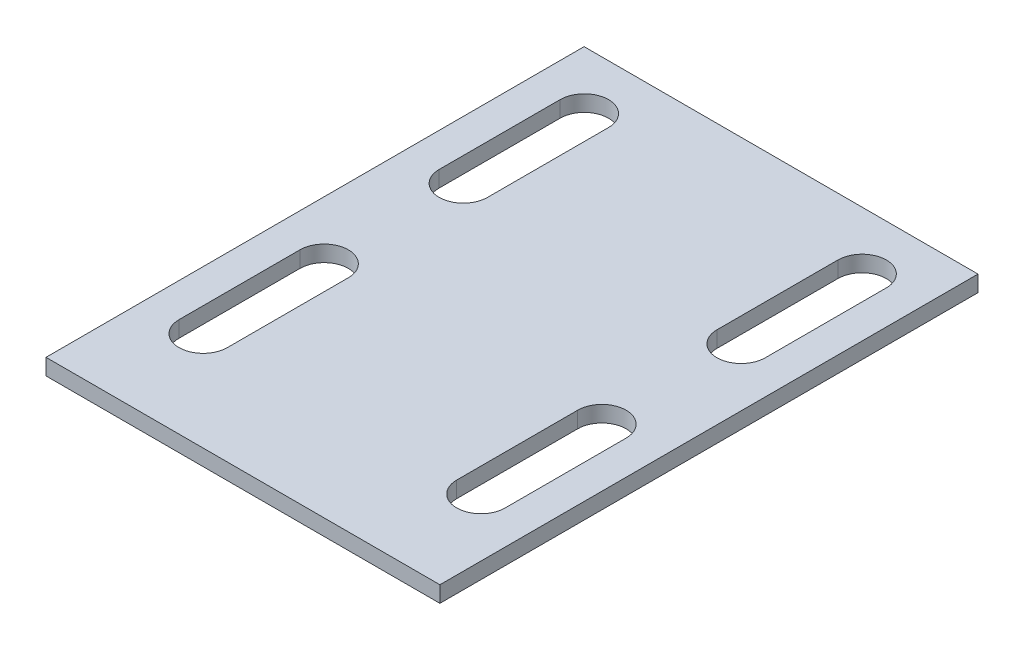
ISO-10303-21;
HEADER;
FILE_DESCRIPTION(('STEP AP214'),'2;1');
FILE_NAME('part.step','',(''),(''),'','','');
FILE_SCHEMA(('AUTOMOTIVE_DESIGN { 1 0 10303 214 1 1 1 1 }'));
ENDSEC;
DATA;
#1=APPLICATION_CONTEXT('core data for automotive mechanical design processes');
#2=APPLICATION_PROTOCOL_DEFINITION('international standard','automotive_design',2000,#1);
#3=PRODUCT_CONTEXT('',#1,'mechanical');
#4=PRODUCT('Part','Part','',(#3));
#5=PRODUCT_RELATED_PRODUCT_CATEGORY('part','',(#4));
#6=PRODUCT_DEFINITION_FORMATION('','',#4);
#7=PRODUCT_DEFINITION_CONTEXT('part definition',#1,'design');
#8=PRODUCT_DEFINITION('design','',#6,#7);
#9=PRODUCT_DEFINITION_SHAPE('','',#8);
#10=(LENGTH_UNIT() NAMED_UNIT(*) SI_UNIT(.MILLI.,.METRE.));
#11=(NAMED_UNIT(*) PLANE_ANGLE_UNIT() SI_UNIT($,.RADIAN.));
#12=(NAMED_UNIT(*) SI_UNIT($,.STERADIAN.) SOLID_ANGLE_UNIT());
#13=UNCERTAINTY_MEASURE_WITH_UNIT(LENGTH_MEASURE(1.E-05),#10,'distance_accuracy_value','');
#14=(GEOMETRIC_REPRESENTATION_CONTEXT(3) GLOBAL_UNCERTAINTY_ASSIGNED_CONTEXT((#13)) GLOBAL_UNIT_ASSIGNED_CONTEXT((#10,
#11,#12)) REPRESENTATION_CONTEXT('',''));
#15=CARTESIAN_POINT('',(0.,0.,0.));
#16=DIRECTION('',(0.,0.,1.));
#17=DIRECTION('',(1.,0.,0.));
#18=AXIS2_PLACEMENT_3D('',#15,#16,#17);
#19=CARTESIAN_POINT('',(0.,5.,0.));
#20=DIRECTION('',(0.,1.,0.));
#21=DIRECTION('',(0.,0.,1.));
#22=AXIS2_PLACEMENT_3D('',#19,#20,#21);
#23=PLANE('',#22);
#24=DIRECTION('',(0.,0.,1.));
#25=VECTOR('',#24,1.);
#26=CARTESIAN_POINT('',(10.5000000000001,5.,0.));
#27=LINE('',#26,#25);
#28=CARTESIAN_POINT('',(10.5000000000001,5.,-87.2215680213413));
#29=VERTEX_POINT('',#28);
#30=CARTESIAN_POINT('',(10.5000000000001,5.,-49.7215680213413));
#31=VERTEX_POINT('',#30);
#32=EDGE_CURVE('E272',#29,#31,#27,.T.);
#33=ORIENTED_EDGE('',*,*,#32,.F.);
#34=CARTESIAN_POINT('',(18.0000000000001,5.,-87.2215680213413));
#35=DIRECTION('',(0.,1.,0.));
#36=DIRECTION('',(0.,0.,1.));
#37=AXIS2_PLACEMENT_3D('',#34,#35,#36);
#38=CIRCLE('',#37,7.49999999999999);
#39=CARTESIAN_POINT('',(25.5000000000001,5.,-87.2215680213413));
#40=VERTEX_POINT('',#39);
#41=EDGE_CURVE('E259',#40,#29,#38,.T.);
#42=ORIENTED_EDGE('',*,*,#41,.F.);
#43=DIRECTION('',(0.,0.,1.));
#44=VECTOR('',#43,1.);
#45=CARTESIAN_POINT('',(25.5000000000001,5.,0.));
#46=LINE('',#45,#44);
#47=CARTESIAN_POINT('',(25.5000000000001,5.,-49.7215680213413));
#48=VERTEX_POINT('',#47);
#49=EDGE_CURVE('E264',#40,#48,#46,.T.);
#50=ORIENTED_EDGE('',*,*,#49,.T.);
#51=CARTESIAN_POINT('',(18.0000000000001,5.,-49.7215680213413));
#52=DIRECTION('',(0.,1.,0.));
#53=DIRECTION('',(0.,0.,1.));
#54=AXIS2_PLACEMENT_3D('',#51,#52,#53);
#55=CIRCLE('',#54,7.49999999999999);
#56=EDGE_CURVE('E268',#31,#48,#55,.T.);
#57=ORIENTED_EDGE('',*,*,#56,.F.);
#58=EDGE_LOOP('',(#33,#42,#50,#57));
#59=FACE_BOUND('',#58,.T.);
#60=DIRECTION('',(0.,0.,1.));
#61=VECTOR('',#60,1.);
#62=CARTESIAN_POINT('',(10.5000000000001,5.,0.));
#63=LINE('',#62,#61);
#64=CARTESIAN_POINT('',(10.5000000000001,5.,-167.875007928777));
#65=VERTEX_POINT('',#64);
#66=CARTESIAN_POINT('',(10.5000000000001,5.,-130.375007928777));
#67=VERTEX_POINT('',#66);
#68=EDGE_CURVE('E226',#65,#67,#63,.T.);
#69=ORIENTED_EDGE('',*,*,#68,.F.);
#70=CARTESIAN_POINT('',(18.0000000000001,5.,-167.875007928777));
#71=DIRECTION('',(0.,1.,0.));
#72=DIRECTION('',(0.,0.,1.));
#73=AXIS2_PLACEMENT_3D('',#70,#71,#72);
#74=CIRCLE('',#73,7.5);
#75=CARTESIAN_POINT('',(25.5000000000001,5.,-167.875007928777));
#76=VERTEX_POINT('',#75);
#77=EDGE_CURVE('E213',#76,#65,#74,.T.);
#78=ORIENTED_EDGE('',*,*,#77,.F.);
#79=DIRECTION('',(0.,0.,1.));
#80=VECTOR('',#79,1.);
#81=CARTESIAN_POINT('',(25.4999999999997,5.,0.));
#82=LINE('',#81,#80);
#83=CARTESIAN_POINT('',(25.5,5.,-130.375007928777));
#84=VERTEX_POINT('',#83);
#85=EDGE_CURVE('E218',#76,#84,#82,.T.);
#86=ORIENTED_EDGE('',*,*,#85,.T.);
#87=CARTESIAN_POINT('',(18.,5.,-130.375007928777));
#88=DIRECTION('',(0.,1.,0.));
#89=DIRECTION('',(0.,0.,1.));
#90=AXIS2_PLACEMENT_3D('',#87,#88,#89);
#91=CIRCLE('',#90,7.49999999999995);
#92=EDGE_CURVE('E222',#67,#84,#91,.T.);
#93=ORIENTED_EDGE('',*,*,#92,.F.);
#94=EDGE_LOOP('',(#69,#78,#86,#93));
#95=FACE_BOUND('',#94,.T.);
#96=DIRECTION('',(0.,0.,1.));
#97=VECTOR('',#96,1.);
#98=CARTESIAN_POINT('',(111.6,5.,0.));
#99=LINE('',#98,#97);
#100=CARTESIAN_POINT('',(111.6,5.,-167.875007928777));
#101=VERTEX_POINT('',#100);
#102=CARTESIAN_POINT('',(111.6,5.,-130.375007928777));
#103=VERTEX_POINT('',#102);
#104=EDGE_CURVE('E355',#101,#103,#99,.T.);
#105=ORIENTED_EDGE('',*,*,#104,.T.);
#106=CARTESIAN_POINT('',(104.1,5.,-130.375007928777));
#107=DIRECTION('',(0.,1.,0.));
#108=DIRECTION('',(0.,0.,1.));
#109=AXIS2_PLACEMENT_3D('',#106,#107,#108);
#110=CIRCLE('',#109,7.49999999999995);
#111=CARTESIAN_POINT('',(96.6,5.,-130.375007928777));
#112=VERTEX_POINT('',#111);
#113=EDGE_CURVE('E304',#103,#112,#110,.F.);
#114=ORIENTED_EDGE('',*,*,#113,.T.);
#115=DIRECTION('',(0.,0.,1.));
#116=VECTOR('',#115,1.);
#117=CARTESIAN_POINT('',(96.6000000000002,5.,-1.78745906964651E-13));
#118=LINE('',#117,#116);
#119=CARTESIAN_POINT('',(96.5999999999999,5.,-167.875007928777));
#120=VERTEX_POINT('',#119);
#121=EDGE_CURVE('E346',#120,#112,#118,.T.);
#122=ORIENTED_EDGE('',*,*,#121,.F.);
#123=CARTESIAN_POINT('',(104.1,5.,-167.875007928777));
#124=DIRECTION('',(0.,1.,0.));
#125=DIRECTION('',(0.,0.,1.));
#126=AXIS2_PLACEMENT_3D('',#123,#124,#125);
#127=CIRCLE('',#126,7.5);
#128=EDGE_CURVE('E351',#120,#101,#127,.F.);
#129=ORIENTED_EDGE('',*,*,#128,.T.);
#130=EDGE_LOOP('',(#105,#114,#122,#129));
#131=FACE_BOUND('',#130,.T.);
#132=DIRECTION('',(0.,0.,1.));
#133=VECTOR('',#132,1.);
#134=CARTESIAN_POINT('',(111.6,5.,0.));
#135=LINE('',#134,#133);
#136=CARTESIAN_POINT('',(111.6,5.,-87.2215680213414));
#137=VERTEX_POINT('',#136);
#138=CARTESIAN_POINT('',(111.6,5.,-49.7215680213414));
#139=VERTEX_POINT('',#138);
#140=EDGE_CURVE('E314',#137,#139,#135,.T.);
#141=ORIENTED_EDGE('',*,*,#140,.T.);
#142=CARTESIAN_POINT('',(104.1,5.,-49.7215680213414));
#143=DIRECTION('',(0.,1.,0.));
#144=DIRECTION('',(0.,0.,1.));
#145=AXIS2_PLACEMENT_3D('',#142,#143,#144);
#146=CIRCLE('',#145,7.49999999999999);
#147=CARTESIAN_POINT('',(96.6,5.,-49.7215680213414));
#148=VERTEX_POINT('',#147);
#149=EDGE_CURVE('E258',#139,#148,#146,.F.);
#150=ORIENTED_EDGE('',*,*,#149,.T.);
#151=DIRECTION('',(0.,0.,1.));
#152=VECTOR('',#151,1.);
#153=CARTESIAN_POINT('',(96.6,5.,0.));
#154=LINE('',#153,#152);
#155=CARTESIAN_POINT('',(96.6,5.,-87.2215680213414));
#156=VERTEX_POINT('',#155);
#157=EDGE_CURVE('E305',#156,#148,#154,.T.);
#158=ORIENTED_EDGE('',*,*,#157,.F.);
#159=CARTESIAN_POINT('',(104.1,5.,-87.2215680213414));
#160=DIRECTION('',(0.,1.,0.));
#161=DIRECTION('',(0.,0.,1.));
#162=AXIS2_PLACEMENT_3D('',#159,#160,#161);
#163=CIRCLE('',#162,7.49999999999999);
#164=EDGE_CURVE('E310',#156,#137,#163,.F.);
#165=ORIENTED_EDGE('',*,*,#164,.T.);
#166=EDGE_LOOP('',(#141,#150,#158,#165));
#167=FACE_BOUND('',#166,.T.);
#168=DIRECTION('',(0.,0.,-1.));
#169=VECTOR('',#168,1.);
#170=CARTESIAN_POINT('',(0.,5.,0.));
#171=LINE('',#170,#169);
#172=CARTESIAN_POINT('',(0.,5.,-19.));
#173=VERTEX_POINT('',#172);
#174=CARTESIAN_POINT('',(0.,5.,-185.8));
#175=VERTEX_POINT('',#174);
#176=EDGE_CURVE('E192',#173,#175,#171,.T.);
#177=ORIENTED_EDGE('',*,*,#176,.F.);
#178=DIRECTION('',(1.,0.,0.));
#179=VECTOR('',#178,1.);
#180=CARTESIAN_POINT('',(0.,5.,-19.));
#181=LINE('',#180,#179);
#182=CARTESIAN_POINT('',(122.1,5.,-19.));
#183=VERTEX_POINT('',#182);
#184=EDGE_CURVE('E54',#173,#183,#181,.T.);
#185=ORIENTED_EDGE('',*,*,#184,.T.);
#186=DIRECTION('',(0.,0.,-1.));
#187=VECTOR('',#186,1.);
#188=CARTESIAN_POINT('',(122.1,5.,0.));
#189=LINE('',#188,#187);
#190=CARTESIAN_POINT('',(122.1,5.,-185.8));
#191=VERTEX_POINT('',#190);
#192=EDGE_CURVE('E188',#183,#191,#189,.T.);
#193=ORIENTED_EDGE('',*,*,#192,.T.);
#194=DIRECTION('',(-1.,0.,0.));
#195=VECTOR('',#194,1.);
#196=CARTESIAN_POINT('',(0.,5.,-185.8));
#197=LINE('',#196,#195);
#198=EDGE_CURVE('E377',#191,#175,#197,.T.);
#199=ORIENTED_EDGE('',*,*,#198,.T.);
#200=EDGE_LOOP('',(#177,#185,#193,#199));
#201=FACE_BOUND('',#200,.T.);
#202=ADVANCED_FACE('F38',(#59,#95,#131,#167,#201),#23,.T.);
#203=CARTESIAN_POINT('',(0.,0.,0.));
#204=DIRECTION('',(0.,1.,0.));
#205=DIRECTION('',(0.,0.,1.));
#206=AXIS2_PLACEMENT_3D('',#203,#204,#205);
#207=PLANE('',#206);
#208=CARTESIAN_POINT('',(18.0000000000001,0.,-87.2215680213413));
#209=DIRECTION('',(0.,1.,0.));
#210=DIRECTION('',(0.,0.,1.));
#211=AXIS2_PLACEMENT_3D('',#208,#209,#210);
#212=CIRCLE('',#211,7.49999999999999);
#213=CARTESIAN_POINT('',(25.5000000000001,0.,-87.2215680213413));
#214=VERTEX_POINT('',#213);
#215=CARTESIAN_POINT('',(10.5000000000001,0.,-87.2215680213413));
#216=VERTEX_POINT('',#215);
#217=EDGE_CURVE('E249',#214,#216,#212,.T.);
#218=ORIENTED_EDGE('',*,*,#217,.T.);
#219=DIRECTION('',(0.,0.,1.));
#220=VECTOR('',#219,1.);
#221=CARTESIAN_POINT('',(10.5000000000001,0.,0.));
#222=LINE('',#221,#220);
#223=CARTESIAN_POINT('',(10.5000000000001,0.,-49.7215680213413));
#224=VERTEX_POINT('',#223);
#225=EDGE_CURVE('E263',#216,#224,#222,.T.);
#226=ORIENTED_EDGE('',*,*,#225,.T.);
#227=CARTESIAN_POINT('',(18.0000000000001,0.,-49.7215680213413));
#228=DIRECTION('',(0.,1.,0.));
#229=DIRECTION('',(0.,0.,1.));
#230=AXIS2_PLACEMENT_3D('',#227,#228,#229);
#231=CIRCLE('',#230,7.49999999999999);
#232=CARTESIAN_POINT('',(25.5000000000001,0.,-49.7215680213413));
#233=VERTEX_POINT('',#232);
#234=EDGE_CURVE('E283',#224,#233,#231,.T.);
#235=ORIENTED_EDGE('',*,*,#234,.T.);
#236=DIRECTION('',(0.,0.,1.));
#237=VECTOR('',#236,1.);
#238=CARTESIAN_POINT('',(25.5000000000001,0.,0.));
#239=LINE('',#238,#237);
#240=EDGE_CURVE('E279',#214,#233,#239,.T.);
#241=ORIENTED_EDGE('',*,*,#240,.F.);
#242=EDGE_LOOP('',(#218,#226,#235,#241));
#243=FACE_BOUND('',#242,.T.);
#244=CARTESIAN_POINT('',(104.1,0.,-130.375007928777));
#245=DIRECTION('',(0.,1.,0.));
#246=DIRECTION('',(0.,0.,1.));
#247=AXIS2_PLACEMENT_3D('',#244,#245,#246);
#248=CIRCLE('',#247,7.49999999999995);
#249=CARTESIAN_POINT('',(111.6,0.,-130.375007928777));
#250=VERTEX_POINT('',#249);
#251=CARTESIAN_POINT('',(96.6,0.,-130.375007928777));
#252=VERTEX_POINT('',#251);
#253=EDGE_CURVE('E350',#250,#252,#248,.F.);
#254=ORIENTED_EDGE('',*,*,#253,.F.);
#255=DIRECTION('',(0.,0.,1.));
#256=VECTOR('',#255,1.);
#257=CARTESIAN_POINT('',(111.6,0.,0.));
#258=LINE('',#257,#256);
#259=CARTESIAN_POINT('',(111.6,0.,-167.875007928777));
#260=VERTEX_POINT('',#259);
#261=EDGE_CURVE('E369',#260,#250,#258,.T.);
#262=ORIENTED_EDGE('',*,*,#261,.F.);
#263=CARTESIAN_POINT('',(104.1,0.,-167.875007928777));
#264=DIRECTION('',(0.,1.,0.));
#265=DIRECTION('',(0.,0.,1.));
#266=AXIS2_PLACEMENT_3D('',#263,#264,#265);
#267=CIRCLE('',#266,7.5);
#268=CARTESIAN_POINT('',(96.5999999999999,0.,-167.875007928777));
#269=VERTEX_POINT('',#268);
#270=EDGE_CURVE('E365',#269,#260,#267,.F.);
#271=ORIENTED_EDGE('',*,*,#270,.F.);
#272=DIRECTION('',(0.,0.,1.));
#273=VECTOR('',#272,1.);
#274=CARTESIAN_POINT('',(96.6000000000002,0.,-1.78745906964651E-13));
#275=LINE('',#274,#273);
#276=EDGE_CURVE('E338',#269,#252,#275,.T.);
#277=ORIENTED_EDGE('',*,*,#276,.T.);
#278=EDGE_LOOP('',(#254,#262,#271,#277));
#279=FACE_BOUND('',#278,.T.);
#280=CARTESIAN_POINT('',(18.0000000000001,0.,-167.875007928777));
#281=DIRECTION('',(0.,1.,0.));
#282=DIRECTION('',(0.,0.,1.));
#283=AXIS2_PLACEMENT_3D('',#280,#281,#282);
#284=CIRCLE('',#283,7.5);
#285=CARTESIAN_POINT('',(25.5000000000001,0.,-167.875007928777));
#286=VERTEX_POINT('',#285);
#287=CARTESIAN_POINT('',(10.5000000000001,0.,-167.875007928777));
#288=VERTEX_POINT('',#287);
#289=EDGE_CURVE('E205',#286,#288,#284,.T.);
#290=ORIENTED_EDGE('',*,*,#289,.T.);
#291=DIRECTION('',(0.,0.,1.));
#292=VECTOR('',#291,1.);
#293=CARTESIAN_POINT('',(10.5000000000001,0.,0.));
#294=LINE('',#293,#292);
#295=CARTESIAN_POINT('',(10.5000000000001,0.,-130.375007928777));
#296=VERTEX_POINT('',#295);
#297=EDGE_CURVE('E217',#288,#296,#294,.T.);
#298=ORIENTED_EDGE('',*,*,#297,.T.);
#299=CARTESIAN_POINT('',(18.,0.,-130.375007928777));
#300=DIRECTION('',(0.,1.,0.));
#301=DIRECTION('',(0.,0.,1.));
#302=AXIS2_PLACEMENT_3D('',#299,#300,#301);
#303=CIRCLE('',#302,7.49999999999995);
#304=CARTESIAN_POINT('',(25.5,0.,-130.375007928777));
#305=VERTEX_POINT('',#304);
#306=EDGE_CURVE('E237',#296,#305,#303,.T.);
#307=ORIENTED_EDGE('',*,*,#306,.T.);
#308=DIRECTION('',(0.,0.,1.));
#309=VECTOR('',#308,1.);
#310=CARTESIAN_POINT('',(25.4999999999997,0.,0.));
#311=LINE('',#310,#309);
#312=EDGE_CURVE('E233',#286,#305,#311,.T.);
#313=ORIENTED_EDGE('',*,*,#312,.F.);
#314=EDGE_LOOP('',(#290,#298,#307,#313));
#315=FACE_BOUND('',#314,.T.);
#316=CARTESIAN_POINT('',(104.1,0.,-49.7215680213414));
#317=DIRECTION('',(0.,1.,0.));
#318=DIRECTION('',(0.,0.,1.));
#319=AXIS2_PLACEMENT_3D('',#316,#317,#318);
#320=CIRCLE('',#319,7.49999999999999);
#321=CARTESIAN_POINT('',(111.6,0.,-49.7215680213414));
#322=VERTEX_POINT('',#321);
#323=CARTESIAN_POINT('',(96.6,0.,-49.7215680213414));
#324=VERTEX_POINT('',#323);
#325=EDGE_CURVE('E309',#322,#324,#320,.F.);
#326=ORIENTED_EDGE('',*,*,#325,.F.);
#327=DIRECTION('',(0.,0.,1.));
#328=VECTOR('',#327,1.);
#329=CARTESIAN_POINT('',(111.6,0.,0.));
#330=LINE('',#329,#328);
#331=CARTESIAN_POINT('',(111.6,0.,-87.2215680213414));
#332=VERTEX_POINT('',#331);
#333=EDGE_CURVE('E328',#332,#322,#330,.T.);
#334=ORIENTED_EDGE('',*,*,#333,.F.);
#335=CARTESIAN_POINT('',(104.1,0.,-87.2215680213414));
#336=DIRECTION('',(0.,1.,0.));
#337=DIRECTION('',(0.,0.,1.));
#338=AXIS2_PLACEMENT_3D('',#335,#336,#337);
#339=CIRCLE('',#338,7.49999999999999);
#340=CARTESIAN_POINT('',(96.6,0.,-87.2215680213414));
#341=VERTEX_POINT('',#340);
#342=EDGE_CURVE('E324',#341,#332,#339,.F.);
#343=ORIENTED_EDGE('',*,*,#342,.F.);
#344=DIRECTION('',(0.,0.,1.));
#345=VECTOR('',#344,1.);
#346=CARTESIAN_POINT('',(96.6,0.,0.));
#347=LINE('',#346,#345);
#348=EDGE_CURVE('E295',#341,#324,#347,.T.);
#349=ORIENTED_EDGE('',*,*,#348,.T.);
#350=EDGE_LOOP('',(#326,#334,#343,#349));
#351=FACE_BOUND('',#350,.T.);
#352=DIRECTION('',(1.,0.,0.));
#353=VECTOR('',#352,1.);
#354=CARTESIAN_POINT('',(0.,0.,-19.));
#355=LINE('',#354,#353);
#356=CARTESIAN_POINT('',(0.,0.,-19.));
#357=VERTEX_POINT('',#356);
#358=CARTESIAN_POINT('',(122.1,0.,-19.));
#359=VERTEX_POINT('',#358);
#360=EDGE_CURVE('E175',#357,#359,#355,.T.);
#361=ORIENTED_EDGE('',*,*,#360,.F.);
#362=DIRECTION('',(0.,0.,-1.));
#363=VECTOR('',#362,1.);
#364=CARTESIAN_POINT('',(0.,0.,0.));
#365=LINE('',#364,#363);
#366=CARTESIAN_POINT('',(0.,0.,-185.8));
#367=VERTEX_POINT('',#366);
#368=EDGE_CURVE('E61',#357,#367,#365,.T.);
#369=ORIENTED_EDGE('',*,*,#368,.T.);
#370=DIRECTION('',(-1.,0.,0.));
#371=VECTOR('',#370,1.);
#372=CARTESIAN_POINT('',(0.,0.,-185.8));
#373=LINE('',#372,#371);
#374=CARTESIAN_POINT('',(122.1,0.,-185.8));
#375=VERTEX_POINT('',#374);
#376=EDGE_CURVE('E381',#375,#367,#373,.T.);
#377=ORIENTED_EDGE('',*,*,#376,.F.);
#378=DIRECTION('',(0.,0.,-1.));
#379=VECTOR('',#378,1.);
#380=CARTESIAN_POINT('',(122.1,0.,0.));
#381=LINE('',#380,#379);
#382=EDGE_CURVE('E181',#359,#375,#381,.T.);
#383=ORIENTED_EDGE('',*,*,#382,.F.);
#384=EDGE_LOOP('',(#361,#369,#377,#383));
#385=FACE_BOUND('',#384,.T.);
#386=ADVANCED_FACE('F180',(#243,#279,#315,#351,#385),#207,.F.);
#387=CARTESIAN_POINT('',(122.1,5.,0.));
#388=DIRECTION('',(-1.,0.,0.));
#389=DIRECTION('',(0.,0.,1.));
#390=AXIS2_PLACEMENT_3D('',#387,#388,#389);
#391=PLANE('',#390);
#392=DIRECTION('',(0.,1.,0.));
#393=VECTOR('',#392,1.);
#394=CARTESIAN_POINT('',(122.1,5.,-19.));
#395=LINE('',#394,#393);
#396=EDGE_CURVE('E384',#359,#183,#395,.T.);
#397=ORIENTED_EDGE('',*,*,#396,.F.);
#398=ORIENTED_EDGE('',*,*,#382,.T.);
#399=DIRECTION('',(0.,-1.,0.));
#400=VECTOR('',#399,1.);
#401=CARTESIAN_POINT('',(122.1,5.,-185.8));
#402=LINE('',#401,#400);
#403=EDGE_CURVE('E275',#191,#375,#402,.T.);
#404=ORIENTED_EDGE('',*,*,#403,.F.);
#405=ORIENTED_EDGE('',*,*,#192,.F.);
#406=EDGE_LOOP('',(#397,#398,#404,#405));
#407=FACE_BOUND('',#406,.T.);
#408=ADVANCED_FACE('F40',(#407),#391,.F.);
#409=CARTESIAN_POINT('',(0.,5.,0.));
#410=DIRECTION('',(-1.,0.,0.));
#411=DIRECTION('',(0.,0.,1.));
#412=AXIS2_PLACEMENT_3D('',#409,#410,#411);
#413=PLANE('',#412);
#414=ORIENTED_EDGE('',*,*,#368,.F.);
#415=DIRECTION('',(0.,1.,0.));
#416=VECTOR('',#415,1.);
#417=CARTESIAN_POINT('',(0.,5.,-19.));
#418=LINE('',#417,#416);
#419=EDGE_CURVE('E11',#357,#173,#418,.T.);
#420=ORIENTED_EDGE('',*,*,#419,.T.);
#421=ORIENTED_EDGE('',*,*,#176,.T.);
#422=DIRECTION('',(0.,-1.,0.));
#423=VECTOR('',#422,1.);
#424=CARTESIAN_POINT('',(0.,5.,-185.8));
#425=LINE('',#424,#423);
#426=EDGE_CURVE('E47',#175,#367,#425,.T.);
#427=ORIENTED_EDGE('',*,*,#426,.T.);
#428=EDGE_LOOP('',(#414,#420,#421,#427));
#429=FACE_BOUND('',#428,.T.);
#430=ADVANCED_FACE('F185',(#429),#413,.T.);
#431=CARTESIAN_POINT('',(10.5000000000001,0.,0.));
#432=DIRECTION('',(-1.,0.,0.));
#433=DIRECTION('',(0.,0.,1.));
#434=AXIS2_PLACEMENT_3D('',#431,#432,#433);
#435=PLANE('',#434);
#436=ORIENTED_EDGE('',*,*,#68,.T.);
#437=DIRECTION('',(0.,1.,0.));
#438=VECTOR('',#437,1.);
#439=CARTESIAN_POINT('',(10.5000000000001,0.,-130.375007928777));
#440=LINE('',#439,#438);
#441=EDGE_CURVE('E200',#296,#67,#440,.T.);
#442=ORIENTED_EDGE('',*,*,#441,.F.);
#443=ORIENTED_EDGE('',*,*,#297,.F.);
#444=DIRECTION('',(0.,1.,0.));
#445=VECTOR('',#444,1.);
#446=CARTESIAN_POINT('',(10.5000000000001,0.,-167.875007928777));
#447=LINE('',#446,#445);
#448=EDGE_CURVE('E194',#288,#65,#447,.T.);
#449=ORIENTED_EDGE('',*,*,#448,.T.);
#450=EDGE_LOOP('',(#436,#442,#443,#449));
#451=FACE_BOUND('',#450,.T.);
#452=ADVANCED_FACE('F418',(#451),#435,.F.);
#453=CARTESIAN_POINT('',(18.0000000000001,0.,-167.875007928777));
#454=DIRECTION('',(0.,1.,0.));
#455=DIRECTION('',(0.,0.,1.));
#456=AXIS2_PLACEMENT_3D('',#453,#454,#455);
#457=CYLINDRICAL_SURFACE('',#456,7.5);
#458=ORIENTED_EDGE('',*,*,#77,.T.);
#459=ORIENTED_EDGE('',*,*,#448,.F.);
#460=ORIENTED_EDGE('',*,*,#289,.F.);
#461=DIRECTION('',(0.,1.,0.));
#462=VECTOR('',#461,1.);
#463=CARTESIAN_POINT('',(25.5000000000001,0.,-167.875007928777));
#464=LINE('',#463,#462);
#465=EDGE_CURVE('E208',#286,#76,#464,.T.);
#466=ORIENTED_EDGE('',*,*,#465,.T.);
#467=EDGE_LOOP('',(#458,#459,#460,#466));
#468=FACE_BOUND('',#467,.T.);
#469=ADVANCED_FACE('F426',(#468),#457,.F.);
#470=CARTESIAN_POINT('',(25.4999999999997,0.,0.));
#471=DIRECTION('',(-1.,0.,0.));
#472=DIRECTION('',(0.,0.,1.));
#473=AXIS2_PLACEMENT_3D('',#470,#471,#472);
#474=PLANE('',#473);
#475=ORIENTED_EDGE('',*,*,#85,.F.);
#476=ORIENTED_EDGE('',*,*,#465,.F.);
#477=ORIENTED_EDGE('',*,*,#312,.T.);
#478=DIRECTION('',(0.,1.,0.));
#479=VECTOR('',#478,1.);
#480=CARTESIAN_POINT('',(25.5,0.,-130.375007928777));
#481=LINE('',#480,#479);
#482=EDGE_CURVE('E204',#305,#84,#481,.T.);
#483=ORIENTED_EDGE('',*,*,#482,.T.);
#484=EDGE_LOOP('',(#475,#476,#477,#483));
#485=FACE_BOUND('',#484,.T.);
#486=ADVANCED_FACE('F451',(#485),#474,.T.);
#487=CARTESIAN_POINT('',(18.,0.,-130.375007928777));
#488=DIRECTION('',(0.,1.,0.));
#489=DIRECTION('',(0.,0.,1.));
#490=AXIS2_PLACEMENT_3D('',#487,#488,#489);
#491=CYLINDRICAL_SURFACE('',#490,7.49999999999995);
#492=ORIENTED_EDGE('',*,*,#92,.T.);
#493=ORIENTED_EDGE('',*,*,#482,.F.);
#494=ORIENTED_EDGE('',*,*,#306,.F.);
#495=ORIENTED_EDGE('',*,*,#441,.T.);
#496=EDGE_LOOP('',(#492,#493,#494,#495));
#497=FACE_BOUND('',#496,.T.);
#498=ADVANCED_FACE('F459',(#497),#491,.F.);
#499=CARTESIAN_POINT('',(104.1,0.,-130.375007928777));
#500=DIRECTION('',(0.,1.,0.));
#501=DIRECTION('',(0.,0.,1.));
#502=AXIS2_PLACEMENT_3D('',#499,#500,#501);
#503=CYLINDRICAL_SURFACE('',#502,7.49999999999995);
#504=ORIENTED_EDGE('',*,*,#113,.F.);
#505=DIRECTION('',(0.,1.,0.));
#506=VECTOR('',#505,1.);
#507=CARTESIAN_POINT('',(111.6,0.,-130.375007928777));
#508=LINE('',#507,#506);
#509=EDGE_CURVE('E333',#250,#103,#508,.T.);
#510=ORIENTED_EDGE('',*,*,#509,.F.);
#511=ORIENTED_EDGE('',*,*,#253,.T.);
#512=DIRECTION('',(0.,1.,0.));
#513=VECTOR('',#512,1.);
#514=CARTESIAN_POINT('',(96.6,0.,-130.375007928777));
#515=LINE('',#514,#513);
#516=EDGE_CURVE('E229',#252,#112,#515,.T.);
#517=ORIENTED_EDGE('',*,*,#516,.T.);
#518=EDGE_LOOP('',(#504,#510,#511,#517));
#519=FACE_BOUND('',#518,.T.);
#520=ADVANCED_FACE('F467',(#519),#503,.F.);
#521=CARTESIAN_POINT('',(96.6000000000002,0.,-1.78745906964651E-13));
#522=DIRECTION('',(-1.,0.,0.));
#523=DIRECTION('',(0.,0.,1.));
#524=AXIS2_PLACEMENT_3D('',#521,#522,#523);
#525=PLANE('',#524);
#526=ORIENTED_EDGE('',*,*,#121,.T.);
#527=ORIENTED_EDGE('',*,*,#516,.F.);
#528=ORIENTED_EDGE('',*,*,#276,.F.);
#529=DIRECTION('',(0.,1.,0.));
#530=VECTOR('',#529,1.);
#531=CARTESIAN_POINT('',(96.5999999999999,0.,-167.875007928777));
#532=LINE('',#531,#530);
#533=EDGE_CURVE('E341',#269,#120,#532,.T.);
#534=ORIENTED_EDGE('',*,*,#533,.T.);
#535=EDGE_LOOP('',(#526,#527,#528,#534));
#536=FACE_BOUND('',#535,.T.);
#537=ADVANCED_FACE('F474',(#536),#525,.F.);
#538=CARTESIAN_POINT('',(104.1,0.,-167.875007928777));
#539=DIRECTION('',(0.,1.,0.));
#540=DIRECTION('',(0.,0.,1.));
#541=AXIS2_PLACEMENT_3D('',#538,#539,#540);
#542=CYLINDRICAL_SURFACE('',#541,7.5);
#543=ORIENTED_EDGE('',*,*,#128,.F.);
#544=ORIENTED_EDGE('',*,*,#533,.F.);
#545=ORIENTED_EDGE('',*,*,#270,.T.);
#546=DIRECTION('',(0.,1.,0.));
#547=VECTOR('',#546,1.);
#548=CARTESIAN_POINT('',(111.6,0.,-167.875007928777));
#549=LINE('',#548,#547);
#550=EDGE_CURVE('E337',#260,#101,#549,.T.);
#551=ORIENTED_EDGE('',*,*,#550,.T.);
#552=EDGE_LOOP('',(#543,#544,#545,#551));
#553=FACE_BOUND('',#552,.T.);
#554=ADVANCED_FACE('F482',(#553),#542,.F.);
#555=CARTESIAN_POINT('',(111.6,0.,0.));
#556=DIRECTION('',(-1.,0.,0.));
#557=DIRECTION('',(0.,0.,1.));
#558=AXIS2_PLACEMENT_3D('',#555,#556,#557);
#559=PLANE('',#558);
#560=ORIENTED_EDGE('',*,*,#104,.F.);
#561=ORIENTED_EDGE('',*,*,#550,.F.);
#562=ORIENTED_EDGE('',*,*,#261,.T.);
#563=ORIENTED_EDGE('',*,*,#509,.T.);
#564=EDGE_LOOP('',(#560,#561,#562,#563));
#565=FACE_BOUND('',#564,.T.);
#566=ADVANCED_FACE('F489',(#565),#559,.T.);
#567=CARTESIAN_POINT('',(104.1,0.,-49.7215680213414));
#568=DIRECTION('',(0.,1.,0.));
#569=DIRECTION('',(0.,0.,1.));
#570=AXIS2_PLACEMENT_3D('',#567,#568,#569);
#571=CYLINDRICAL_SURFACE('',#570,7.49999999999999);
#572=ORIENTED_EDGE('',*,*,#149,.F.);
#573=DIRECTION('',(0.,1.,0.));
#574=VECTOR('',#573,1.);
#575=CARTESIAN_POINT('',(111.6,0.,-49.7215680213414));
#576=LINE('',#575,#574);
#577=EDGE_CURVE('E290',#322,#139,#576,.T.);
#578=ORIENTED_EDGE('',*,*,#577,.F.);
#579=ORIENTED_EDGE('',*,*,#325,.T.);
#580=DIRECTION('',(0.,1.,0.));
#581=VECTOR('',#580,1.);
#582=CARTESIAN_POINT('',(96.6,0.,-49.7215680213414));
#583=LINE('',#582,#581);
#584=EDGE_CURVE('E301',#324,#148,#583,.T.);
#585=ORIENTED_EDGE('',*,*,#584,.T.);
#586=EDGE_LOOP('',(#572,#578,#579,#585));
#587=FACE_BOUND('',#586,.T.);
#588=ADVANCED_FACE('F497',(#587),#571,.F.);
#589=CARTESIAN_POINT('',(96.6,0.,0.));
#590=DIRECTION('',(-1.,0.,0.));
#591=DIRECTION('',(0.,0.,1.));
#592=AXIS2_PLACEMENT_3D('',#589,#590,#591);
#593=PLANE('',#592);
#594=ORIENTED_EDGE('',*,*,#157,.T.);
#595=ORIENTED_EDGE('',*,*,#584,.F.);
#596=ORIENTED_EDGE('',*,*,#348,.F.);
#597=DIRECTION('',(0.,1.,0.));
#598=VECTOR('',#597,1.);
#599=CARTESIAN_POINT('',(96.6,0.,-87.2215680213414));
#600=LINE('',#599,#598);
#601=EDGE_CURVE('E298',#341,#156,#600,.T.);
#602=ORIENTED_EDGE('',*,*,#601,.T.);
#603=EDGE_LOOP('',(#594,#595,#596,#602));
#604=FACE_BOUND('',#603,.T.);
#605=ADVANCED_FACE('F505',(#604),#593,.F.);
#606=CARTESIAN_POINT('',(104.1,0.,-87.2215680213414));
#607=DIRECTION('',(0.,1.,0.));
#608=DIRECTION('',(0.,0.,1.));
#609=AXIS2_PLACEMENT_3D('',#606,#607,#608);
#610=CYLINDRICAL_SURFACE('',#609,7.49999999999999);
#611=ORIENTED_EDGE('',*,*,#164,.F.);
#612=ORIENTED_EDGE('',*,*,#601,.F.);
#613=ORIENTED_EDGE('',*,*,#342,.T.);
#614=DIRECTION('',(0.,1.,0.));
#615=VECTOR('',#614,1.);
#616=CARTESIAN_POINT('',(111.6,0.,-87.2215680213414));
#617=LINE('',#616,#615);
#618=EDGE_CURVE('E294',#332,#137,#617,.T.);
#619=ORIENTED_EDGE('',*,*,#618,.T.);
#620=EDGE_LOOP('',(#611,#612,#613,#619));
#621=FACE_BOUND('',#620,.T.);
#622=ADVANCED_FACE('F513',(#621),#610,.F.);
#623=CARTESIAN_POINT('',(111.6,0.,0.));
#624=DIRECTION('',(-1.,0.,0.));
#625=DIRECTION('',(0.,0.,1.));
#626=AXIS2_PLACEMENT_3D('',#623,#624,#625);
#627=PLANE('',#626);
#628=ORIENTED_EDGE('',*,*,#140,.F.);
#629=ORIENTED_EDGE('',*,*,#618,.F.);
#630=ORIENTED_EDGE('',*,*,#333,.T.);
#631=ORIENTED_EDGE('',*,*,#577,.T.);
#632=EDGE_LOOP('',(#628,#629,#630,#631));
#633=FACE_BOUND('',#632,.T.);
#634=ADVANCED_FACE('F521',(#633),#627,.T.);
#635=CARTESIAN_POINT('',(10.5000000000001,0.,0.));
#636=DIRECTION('',(-1.,0.,0.));
#637=DIRECTION('',(0.,0.,1.));
#638=AXIS2_PLACEMENT_3D('',#635,#636,#637);
#639=PLANE('',#638);
#640=ORIENTED_EDGE('',*,*,#32,.T.);
#641=DIRECTION('',(0.,1.,0.));
#642=VECTOR('',#641,1.);
#643=CARTESIAN_POINT('',(10.5000000000001,0.,-49.7215680213413));
#644=LINE('',#643,#642);
#645=EDGE_CURVE('E244',#224,#31,#644,.T.);
#646=ORIENTED_EDGE('',*,*,#645,.F.);
#647=ORIENTED_EDGE('',*,*,#225,.F.);
#648=DIRECTION('',(0.,1.,0.));
#649=VECTOR('',#648,1.);
#650=CARTESIAN_POINT('',(10.5000000000001,0.,-87.2215680213413));
#651=LINE('',#650,#649);
#652=EDGE_CURVE('E255',#216,#29,#651,.T.);
#653=ORIENTED_EDGE('',*,*,#652,.T.);
#654=EDGE_LOOP('',(#640,#646,#647,#653));
#655=FACE_BOUND('',#654,.T.);
#656=ADVANCED_FACE('F529',(#655),#639,.F.);
#657=CARTESIAN_POINT('',(18.0000000000001,0.,-87.2215680213413));
#658=DIRECTION('',(0.,1.,0.));
#659=DIRECTION('',(0.,0.,1.));
#660=AXIS2_PLACEMENT_3D('',#657,#658,#659);
#661=CYLINDRICAL_SURFACE('',#660,7.49999999999999);
#662=ORIENTED_EDGE('',*,*,#41,.T.);
#663=ORIENTED_EDGE('',*,*,#652,.F.);
#664=ORIENTED_EDGE('',*,*,#217,.F.);
#665=DIRECTION('',(0.,1.,0.));
#666=VECTOR('',#665,1.);
#667=CARTESIAN_POINT('',(25.5000000000001,0.,-87.2215680213413));
#668=LINE('',#667,#666);
#669=EDGE_CURVE('E252',#214,#40,#668,.T.);
#670=ORIENTED_EDGE('',*,*,#669,.T.);
#671=EDGE_LOOP('',(#662,#663,#664,#670));
#672=FACE_BOUND('',#671,.T.);
#673=ADVANCED_FACE('F537',(#672),#661,.F.);
#674=CARTESIAN_POINT('',(25.5000000000001,0.,0.));
#675=DIRECTION('',(-1.,0.,0.));
#676=DIRECTION('',(0.,0.,1.));
#677=AXIS2_PLACEMENT_3D('',#674,#675,#676);
#678=PLANE('',#677);
#679=ORIENTED_EDGE('',*,*,#49,.F.);
#680=ORIENTED_EDGE('',*,*,#669,.F.);
#681=ORIENTED_EDGE('',*,*,#240,.T.);
#682=DIRECTION('',(0.,1.,0.));
#683=VECTOR('',#682,1.);
#684=CARTESIAN_POINT('',(25.5000000000001,0.,-49.7215680213413));
#685=LINE('',#684,#683);
#686=EDGE_CURVE('E248',#233,#48,#685,.T.);
#687=ORIENTED_EDGE('',*,*,#686,.T.);
#688=EDGE_LOOP('',(#679,#680,#681,#687));
#689=FACE_BOUND('',#688,.T.);
#690=ADVANCED_FACE('F403',(#689),#678,.T.);
#691=CARTESIAN_POINT('',(18.0000000000001,0.,-49.7215680213413));
#692=DIRECTION('',(0.,1.,0.));
#693=DIRECTION('',(0.,0.,1.));
#694=AXIS2_PLACEMENT_3D('',#691,#692,#693);
#695=CYLINDRICAL_SURFACE('',#694,7.49999999999999);
#696=ORIENTED_EDGE('',*,*,#56,.T.);
#697=ORIENTED_EDGE('',*,*,#686,.F.);
#698=ORIENTED_EDGE('',*,*,#234,.F.);
#699=ORIENTED_EDGE('',*,*,#645,.T.);
#700=EDGE_LOOP('',(#696,#697,#698,#699));
#701=FACE_BOUND('',#700,.T.);
#702=ADVANCED_FACE('F396',(#701),#695,.F.);
#703=CARTESIAN_POINT('',(0.,0.,-185.8));
#704=DIRECTION('',(0.,0.,-1.));
#705=DIRECTION('',(-1.,0.,0.));
#706=AXIS2_PLACEMENT_3D('',#703,#704,#705);
#707=PLANE('',#706);
#708=ORIENTED_EDGE('',*,*,#403,.T.);
#709=ORIENTED_EDGE('',*,*,#376,.T.);
#710=ORIENTED_EDGE('',*,*,#426,.F.);
#711=ORIENTED_EDGE('',*,*,#198,.F.);
#712=EDGE_LOOP('',(#708,#709,#710,#711));
#713=FACE_BOUND('',#712,.T.);
#714=ADVANCED_FACE('F394',(#713),#707,.T.);
#715=CARTESIAN_POINT('',(0.,0.,-19.));
#716=DIRECTION('',(0.,0.,1.));
#717=DIRECTION('',(1.,0.,0.));
#718=AXIS2_PLACEMENT_3D('',#715,#716,#717);
#719=PLANE('',#718);
#720=ORIENTED_EDGE('',*,*,#396,.T.);
#721=ORIENTED_EDGE('',*,*,#184,.F.);
#722=ORIENTED_EDGE('',*,*,#419,.F.);
#723=ORIENTED_EDGE('',*,*,#360,.T.);
#724=EDGE_LOOP('',(#720,#721,#722,#723));
#725=FACE_BOUND('',#724,.T.);
#726=ADVANCED_FACE('F174',(#725),#719,.T.);
#727=CLOSED_SHELL('',(#202,#386,#408,#430,#452,#469,#486,#498,#520,#537,#554,#566,#588,#605,
#622,#634,#656,#673,#690,#702,#714,#726));
#728=MANIFOLD_SOLID_BREP('B2',#727);
#729=ADVANCED_BREP_SHAPE_REPRESENTATION('',(#18,#728),#14);
#730=SHAPE_DEFINITION_REPRESENTATION(#9,#729);
ENDSEC;
END-ISO-10303-21;
